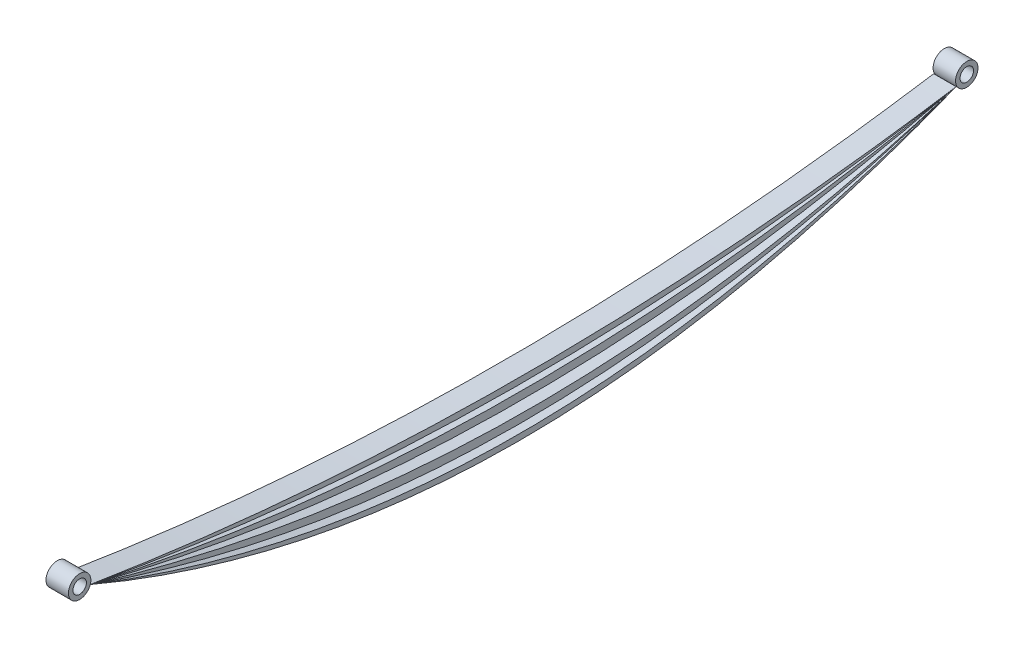
ISO-10303-21;
HEADER;
FILE_DESCRIPTION(('STEP AP214'),'2;1');
FILE_NAME('part.step','',(''),(''),'','','');
FILE_SCHEMA(('AUTOMOTIVE_DESIGN { 1 0 10303 214 1 1 1 1 }'));
ENDSEC;
DATA;
#1=APPLICATION_CONTEXT('core data for automotive mechanical design processes');
#2=APPLICATION_PROTOCOL_DEFINITION('international standard','automotive_design',2000,#1);
#3=PRODUCT_CONTEXT('',#1,'mechanical');
#4=PRODUCT('Part','Part','',(#3));
#5=PRODUCT_RELATED_PRODUCT_CATEGORY('part','',(#4));
#6=PRODUCT_DEFINITION_FORMATION('','',#4);
#7=PRODUCT_DEFINITION_CONTEXT('part definition',#1,'design');
#8=PRODUCT_DEFINITION('design','',#6,#7);
#9=PRODUCT_DEFINITION_SHAPE('','',#8);
#10=(LENGTH_UNIT() NAMED_UNIT(*) SI_UNIT(.MILLI.,.METRE.));
#11=(NAMED_UNIT(*) PLANE_ANGLE_UNIT() SI_UNIT($,.RADIAN.));
#12=(NAMED_UNIT(*) SI_UNIT($,.STERADIAN.) SOLID_ANGLE_UNIT());
#13=UNCERTAINTY_MEASURE_WITH_UNIT(LENGTH_MEASURE(1.E-05),#10,'distance_accuracy_value','');
#14=(GEOMETRIC_REPRESENTATION_CONTEXT(3) GLOBAL_UNCERTAINTY_ASSIGNED_CONTEXT((#13)) GLOBAL_UNIT_ASSIGNED_CONTEXT((#10,
#11,#12)) REPRESENTATION_CONTEXT('',''));
#15=CARTESIAN_POINT('',(0.,0.,0.));
#16=DIRECTION('',(0.,0.,1.));
#17=DIRECTION('',(1.,0.,0.));
#18=AXIS2_PLACEMENT_3D('',#15,#16,#17);
#19=CARTESIAN_POINT('',(5.,42.4695904430303,127.780848484848));
#20=CARTESIAN_POINT('',(5.,2.59767544920402,33.8122684678732));
#21=CARTESIAN_POINT('',(5.,42.0800146854546,-65.0591515151515));
#22=B_SPLINE_CURVE_WITH_KNOTS('',2,(#19,#20,#21),.UNSPECIFIED.,.F.,.F.,(3,3),(0.,1.),.UNSPECIFIED.);
#23=DIRECTION('',(-1.,0.,0.));
#24=VECTOR('',#23,1.);
#25=SURFACE_OF_LINEAR_EXTRUSION('',#22,#24);
#26=CARTESIAN_POINT('',(0.,42.4695904430303,127.780848484848));
#27=CARTESIAN_POINT('',(0.,2.59767544920402,33.8122684678732));
#28=CARTESIAN_POINT('',(0.,42.0800146854546,-65.0591515151515));
#29=B_SPLINE_CURVE_WITH_KNOTS('',2,(#26,#27,#28),.UNSPECIFIED.,.F.,.F.,(3,3),(0.,1.),.UNSPECIFIED.);
#30=CARTESIAN_POINT('',(0.,42.4695904430304,127.780848484848));
#31=VERTEX_POINT('',#30);
#32=CARTESIAN_POINT('',(0.,42.0800146854546,-65.0591515151515));
#33=VERTEX_POINT('',#32);
#34=EDGE_CURVE('E425',#31,#33,#29,.T.);
#35=ORIENTED_EDGE('',*,*,#34,.T.);
#36=DIRECTION('',(-1.,0.,0.));
#37=VECTOR('',#36,1.);
#38=CARTESIAN_POINT('',(5.,42.0800146854546,-65.0591515151515));
#39=LINE('',#38,#37);
#40=CARTESIAN_POINT('',(5.,42.0800146854546,-65.0591515151515));
#41=VERTEX_POINT('',#40);
#42=EDGE_CURVE('E13',#41,#33,#39,.T.);
#43=ORIENTED_EDGE('',*,*,#42,.F.);
#44=CARTESIAN_POINT('',(5.,42.4695904430304,127.780848484848));
#45=VERTEX_POINT('',#44);
#46=EDGE_CURVE('E424',#45,#41,#22,.T.);
#47=ORIENTED_EDGE('',*,*,#46,.F.);
#48=DIRECTION('',(-1.,0.,0.));
#49=VECTOR('',#48,1.);
#50=CARTESIAN_POINT('',(5.,42.4695904430304,127.780848484848));
#51=LINE('',#50,#49);
#52=EDGE_CURVE('E402',#45,#31,#51,.T.);
#53=ORIENTED_EDGE('',*,*,#52,.T.);
#54=EDGE_LOOP('',(#35,#43,#47,#53));
#55=FACE_BOUND('',#54,.T.);
#56=ADVANCED_FACE('F393',(#55),#25,.F.);
#57=CARTESIAN_POINT('',(5.,42.0800146854546,-65.0591515151515));
#58=CARTESIAN_POINT('',(5.,19.1425653210827,-2.95565801286543));
#59=CARTESIAN_POINT('',(5.,16.0514051439789,60.7489517648132));
#60=CARTESIAN_POINT('',(5.,42.4695904430304,127.780848484849));
#61=B_SPLINE_CURVE_WITH_KNOTS('',3,(#57,#58,#59,#60),.UNSPECIFIED.,.F.,.F.,(4,4),(0.,1.),.UNSPECIFIED.);
#62=DIRECTION('',(-1.,0.,0.));
#63=VECTOR('',#62,1.);
#64=SURFACE_OF_LINEAR_EXTRUSION('',#61,#63);
#65=CARTESIAN_POINT('',(0.,42.0800146854546,-65.0591515151515));
#66=CARTESIAN_POINT('',(0.,19.1425653210827,-2.95565801286543));
#67=CARTESIAN_POINT('',(0.,16.0514051439789,60.7489517648132));
#68=CARTESIAN_POINT('',(0.,42.4695904430304,127.780848484849));
#69=B_SPLINE_CURVE_WITH_KNOTS('',3,(#65,#66,#67,#68),.UNSPECIFIED.,.F.,.F.,(4,4),(0.,1.),.UNSPECIFIED.);
#70=EDGE_CURVE('E417',#33,#31,#69,.T.);
#71=ORIENTED_EDGE('',*,*,#70,.T.);
#72=ORIENTED_EDGE('',*,*,#52,.F.);
#73=EDGE_CURVE('E409',#41,#45,#61,.T.);
#74=ORIENTED_EDGE('',*,*,#73,.F.);
#75=ORIENTED_EDGE('',*,*,#42,.T.);
#76=EDGE_LOOP('',(#71,#72,#74,#75));
#77=FACE_BOUND('',#76,.T.);
#78=ADVANCED_FACE('F420',(#77),#64,.F.);
#79=CARTESIAN_POINT('',(5.,0.,0.));
#80=DIRECTION('',(1.,0.,0.));
#81=DIRECTION('',(0.,0.,-1.));
#82=AXIS2_PLACEMENT_3D('',#79,#80,#81);
#83=PLANE('',#82);
#84=ORIENTED_EDGE('',*,*,#46,.T.);
#85=ORIENTED_EDGE('',*,*,#73,.T.);
#86=EDGE_LOOP('',(#84,#85));
#87=FACE_BOUND('',#86,.T.);
#88=ADVANCED_FACE('F452',(#87),#83,.T.);
#89=CARTESIAN_POINT('',(0.,0.,0.));
#90=DIRECTION('',(1.,0.,0.));
#91=DIRECTION('',(0.,0.,-1.));
#92=AXIS2_PLACEMENT_3D('',#89,#90,#91);
#93=PLANE('',#92);
#94=ORIENTED_EDGE('',*,*,#34,.F.);
#95=ORIENTED_EDGE('',*,*,#70,.F.);
#96=EDGE_LOOP('',(#94,#95));
#97=FACE_BOUND('',#96,.T.);
#98=ADVANCED_FACE('F428',(#97),#93,.F.);
#99=CLOSED_SHELL('',(#56,#78,#88,#98));
#100=MANIFOLD_SOLID_BREP('B2',#99);
#101=CARTESIAN_POINT('',(5.,42.4695904430303,127.780848484848));
#102=CARTESIAN_POINT('',(5.,9.04748499481751,33.1527153679579));
#103=CARTESIAN_POINT('',(5.,42.0800146854546,-65.0591515151515));
#104=B_SPLINE_CURVE_WITH_KNOTS('',2,(#101,#102,#103),.UNSPECIFIED.,.F.,.F.,(3,3),(0.,1.),.UNSPECIFIED.);
#105=DIRECTION('',(-1.,0.,0.));
#106=VECTOR('',#105,1.);
#107=SURFACE_OF_LINEAR_EXTRUSION('',#104,#106);
#108=CARTESIAN_POINT('',(0.,42.4695904430303,127.780848484848));
#109=CARTESIAN_POINT('',(0.,9.04748499481751,33.1527153679579));
#110=CARTESIAN_POINT('',(0.,42.0800146854546,-65.0591515151515));
#111=B_SPLINE_CURVE_WITH_KNOTS('',2,(#108,#109,#110),.UNSPECIFIED.,.F.,.F.,(3,3),(0.,1.),.UNSPECIFIED.);
#112=CARTESIAN_POINT('',(0.,42.4695904430304,127.780848484848));
#113=VERTEX_POINT('',#112);
#114=CARTESIAN_POINT('',(0.,42.0800146854546,-65.0591515151515));
#115=VERTEX_POINT('',#114);
#116=EDGE_CURVE('E528',#113,#115,#111,.T.);
#117=ORIENTED_EDGE('',*,*,#116,.T.);
#118=DIRECTION('',(-1.,0.,0.));
#119=VECTOR('',#118,1.);
#120=CARTESIAN_POINT('',(5.,42.0800146854546,-65.0591515151515));
#121=LINE('',#120,#119);
#122=CARTESIAN_POINT('',(5.,42.0800146854546,-65.0591515151515));
#123=VERTEX_POINT('',#122);
#124=EDGE_CURVE('E391',#123,#115,#121,.T.);
#125=ORIENTED_EDGE('',*,*,#124,.F.);
#126=CARTESIAN_POINT('',(5.,42.4695904430304,127.780848484848));
#127=VERTEX_POINT('',#126);
#128=EDGE_CURVE('E527',#127,#123,#104,.T.);
#129=ORIENTED_EDGE('',*,*,#128,.F.);
#130=DIRECTION('',(-1.,0.,0.));
#131=VECTOR('',#130,1.);
#132=CARTESIAN_POINT('',(5.,42.4695904430304,127.780848484848));
#133=LINE('',#132,#131);
#134=EDGE_CURVE('E505',#127,#113,#133,.T.);
#135=ORIENTED_EDGE('',*,*,#134,.T.);
#136=EDGE_LOOP('',(#117,#125,#129,#135));
#137=FACE_BOUND('',#136,.T.);
#138=ADVANCED_FACE('F496',(#137),#107,.F.);
#139=CARTESIAN_POINT('',(5.,42.0800146854546,-65.0591515151515));
#140=CARTESIAN_POINT('',(5.,12.5922766256158,28.6722652665019));
#141=CARTESIAN_POINT('',(5.,42.4695904430303,127.780848484848));
#142=B_SPLINE_CURVE_WITH_KNOTS('',2,(#139,#140,#141),.UNSPECIFIED.,.F.,.F.,(3,3),(0.,1.),.UNSPECIFIED.);
#143=DIRECTION('',(-1.,0.,0.));
#144=VECTOR('',#143,1.);
#145=SURFACE_OF_LINEAR_EXTRUSION('',#142,#144);
#146=CARTESIAN_POINT('',(0.,42.0800146854546,-65.0591515151515));
#147=CARTESIAN_POINT('',(0.,12.5922766256158,28.6722652665019));
#148=CARTESIAN_POINT('',(0.,42.4695904430303,127.780848484848));
#149=B_SPLINE_CURVE_WITH_KNOTS('',2,(#146,#147,#148),.UNSPECIFIED.,.F.,.F.,(3,3),(0.,1.),.UNSPECIFIED.);
#150=EDGE_CURVE('E520',#115,#113,#149,.T.);
#151=ORIENTED_EDGE('',*,*,#150,.T.);
#152=ORIENTED_EDGE('',*,*,#134,.F.);
#153=EDGE_CURVE('E512',#123,#127,#142,.T.);
#154=ORIENTED_EDGE('',*,*,#153,.F.);
#155=ORIENTED_EDGE('',*,*,#124,.T.);
#156=EDGE_LOOP('',(#151,#152,#154,#155));
#157=FACE_BOUND('',#156,.T.);
#158=ADVANCED_FACE('F523',(#157),#145,.F.);
#159=CARTESIAN_POINT('',(5.,0.,0.));
#160=DIRECTION('',(1.,0.,0.));
#161=DIRECTION('',(0.,0.,-1.));
#162=AXIS2_PLACEMENT_3D('',#159,#160,#161);
#163=PLANE('',#162);
#164=ORIENTED_EDGE('',*,*,#128,.T.);
#165=ORIENTED_EDGE('',*,*,#153,.T.);
#166=EDGE_LOOP('',(#164,#165));
#167=FACE_BOUND('',#166,.T.);
#168=ADVANCED_FACE('F555',(#167),#163,.T.);
#169=CARTESIAN_POINT('',(0.,0.,0.));
#170=DIRECTION('',(1.,0.,0.));
#171=DIRECTION('',(0.,0.,-1.));
#172=AXIS2_PLACEMENT_3D('',#169,#170,#171);
#173=PLANE('',#172);
#174=ORIENTED_EDGE('',*,*,#116,.F.);
#175=ORIENTED_EDGE('',*,*,#150,.F.);
#176=EDGE_LOOP('',(#174,#175));
#177=FACE_BOUND('',#176,.T.);
#178=ADVANCED_FACE('F531',(#177),#173,.F.);
#179=CLOSED_SHELL('',(#138,#158,#168,#178));
#180=MANIFOLD_SOLID_BREP('B7',#179);
#181=CARTESIAN_POINT('',(5.,42.4695904430303,127.780848484848));
#182=CARTESIAN_POINT('',(5.,21.3439499981108,32.79082066014));
#183=CARTESIAN_POINT('',(5.,42.0800146854546,-65.0591515151515));
#184=B_SPLINE_CURVE_WITH_KNOTS('',2,(#181,#182,#183),.UNSPECIFIED.,.F.,.F.,(3,3),(0.,1.),.UNSPECIFIED.);
#185=DIRECTION('',(-1.,0.,0.));
#186=VECTOR('',#185,1.);
#187=SURFACE_OF_LINEAR_EXTRUSION('',#184,#186);
#188=CARTESIAN_POINT('',(0.,42.4695904430303,127.780848484848));
#189=CARTESIAN_POINT('',(0.,21.3439499981108,32.79082066014));
#190=CARTESIAN_POINT('',(0.,42.0800146854546,-65.0591515151515));
#191=B_SPLINE_CURVE_WITH_KNOTS('',2,(#188,#189,#190),.UNSPECIFIED.,.F.,.F.,(3,3),(0.,1.),.UNSPECIFIED.);
#192=CARTESIAN_POINT('',(0.,42.4695904430304,127.780848484848));
#193=VERTEX_POINT('',#192);
#194=CARTESIAN_POINT('',(0.,42.0800146854546,-65.0591515151515));
#195=VERTEX_POINT('',#194);
#196=EDGE_CURVE('E628',#193,#195,#191,.T.);
#197=ORIENTED_EDGE('',*,*,#196,.F.);
#198=DIRECTION('',(-1.,0.,0.));
#199=VECTOR('',#198,1.);
#200=CARTESIAN_POINT('',(5.,42.4695904430304,127.780848484848));
#201=LINE('',#200,#199);
#202=CARTESIAN_POINT('',(5.,42.4695904430304,127.780848484848));
#203=VERTEX_POINT('',#202);
#204=EDGE_CURVE('E494',#203,#193,#201,.T.);
#205=ORIENTED_EDGE('',*,*,#204,.F.);
#206=CARTESIAN_POINT('',(5.,42.0800146854546,-65.0591515151515));
#207=VERTEX_POINT('',#206);
#208=EDGE_CURVE('E629',#203,#207,#184,.T.);
#209=ORIENTED_EDGE('',*,*,#208,.T.);
#210=DIRECTION('',(-1.,0.,0.));
#211=VECTOR('',#210,1.);
#212=CARTESIAN_POINT('',(5.,42.0800146854546,-65.0591515151515));
#213=LINE('',#212,#211);
#214=EDGE_CURVE('E608',#207,#195,#213,.T.);
#215=ORIENTED_EDGE('',*,*,#214,.T.);
#216=EDGE_LOOP('',(#197,#205,#209,#215));
#217=FACE_BOUND('',#216,.T.);
#218=ADVANCED_FACE('F599',(#217),#187,.T.);
#219=CARTESIAN_POINT('',(5.,42.4695904430303,127.780848484848));
#220=CARTESIAN_POINT('',(5.,17.7906847431026,32.3332020838322));
#221=CARTESIAN_POINT('',(5.,42.0800146854546,-65.0591515151515));
#222=B_SPLINE_CURVE_WITH_KNOTS('',2,(#219,#220,#221),.UNSPECIFIED.,.F.,.F.,(3,3),(0.,1.),.UNSPECIFIED.);
#223=DIRECTION('',(-1.,0.,0.));
#224=VECTOR('',#223,1.);
#225=SURFACE_OF_LINEAR_EXTRUSION('',#222,#224);
#226=CARTESIAN_POINT('',(0.,42.4695904430303,127.780848484848));
#227=CARTESIAN_POINT('',(0.,17.7906847431026,32.3332020838322));
#228=CARTESIAN_POINT('',(0.,42.0800146854546,-65.0591515151515));
#229=B_SPLINE_CURVE_WITH_KNOTS('',2,(#226,#227,#228),.UNSPECIFIED.,.F.,.F.,(3,3),(0.,1.),.UNSPECIFIED.);
#230=EDGE_CURVE('E630',#193,#195,#229,.T.);
#231=ORIENTED_EDGE('',*,*,#230,.T.);
#232=ORIENTED_EDGE('',*,*,#214,.F.);
#233=EDGE_CURVE('E615',#203,#207,#222,.T.);
#234=ORIENTED_EDGE('',*,*,#233,.F.);
#235=ORIENTED_EDGE('',*,*,#204,.T.);
#236=EDGE_LOOP('',(#231,#232,#234,#235));
#237=FACE_BOUND('',#236,.T.);
#238=ADVANCED_FACE('F631',(#237),#225,.F.);
#239=CARTESIAN_POINT('',(5.,0.,0.));
#240=DIRECTION('',(1.,0.,0.));
#241=DIRECTION('',(0.,0.,-1.));
#242=AXIS2_PLACEMENT_3D('',#239,#240,#241);
#243=PLANE('',#242);
#244=ORIENTED_EDGE('',*,*,#208,.F.);
#245=ORIENTED_EDGE('',*,*,#233,.T.);
#246=EDGE_LOOP('',(#244,#245));
#247=FACE_BOUND('',#246,.T.);
#248=ADVANCED_FACE('F658',(#247),#243,.T.);
#249=CARTESIAN_POINT('',(0.,0.,0.));
#250=DIRECTION('',(1.,0.,0.));
#251=DIRECTION('',(0.,0.,-1.));
#252=AXIS2_PLACEMENT_3D('',#249,#250,#251);
#253=PLANE('',#252);
#254=ORIENTED_EDGE('',*,*,#196,.T.);
#255=ORIENTED_EDGE('',*,*,#230,.F.);
#256=EDGE_LOOP('',(#254,#255));
#257=FACE_BOUND('',#256,.T.);
#258=ADVANCED_FACE('F634',(#257),#253,.F.);
#259=CLOSED_SHELL('',(#218,#238,#248,#258));
#260=MANIFOLD_SOLID_BREP('B385',#259);
#261=CARTESIAN_POINT('',(5.,42.4695904430303,127.780848484848));
#262=CARTESIAN_POINT('',(5.,26.9703184578535,31.7553583374396));
#263=CARTESIAN_POINT('',(5.,42.0800146854546,-65.0591515151515));
#264=B_SPLINE_CURVE_WITH_KNOTS('',2,(#261,#262,#263),.UNSPECIFIED.,.F.,.F.,(3,3),(0.,1.),.UNSPECIFIED.);
#265=DIRECTION('',(-1.,0.,0.));
#266=VECTOR('',#265,1.);
#267=SURFACE_OF_LINEAR_EXTRUSION('',#264,#266);
#268=CARTESIAN_POINT('',(0.,42.4695904430303,127.780848484848));
#269=CARTESIAN_POINT('',(0.,26.9703184578535,31.7553583374396));
#270=CARTESIAN_POINT('',(0.,42.0800146854546,-65.0591515151515));
#271=B_SPLINE_CURVE_WITH_KNOTS('',2,(#268,#269,#270),.UNSPECIFIED.,.F.,.F.,(3,3),(0.,1.),.UNSPECIFIED.);
#272=CARTESIAN_POINT('',(0.,42.4695904430304,127.780848484848));
#273=VERTEX_POINT('',#272);
#274=CARTESIAN_POINT('',(0.,42.0800146854546,-65.0591515151515));
#275=VERTEX_POINT('',#274);
#276=EDGE_CURVE('E729',#273,#275,#271,.T.);
#277=ORIENTED_EDGE('',*,*,#276,.F.);
#278=DIRECTION('',(-1.,0.,0.));
#279=VECTOR('',#278,1.);
#280=CARTESIAN_POINT('',(5.,42.4695904430304,127.780848484848));
#281=LINE('',#280,#279);
#282=CARTESIAN_POINT('',(5.,42.4695904430304,127.780848484848));
#283=VERTEX_POINT('',#282);
#284=EDGE_CURVE('E597',#283,#273,#281,.T.);
#285=ORIENTED_EDGE('',*,*,#284,.F.);
#286=CARTESIAN_POINT('',(5.,42.0800146854546,-65.0591515151515));
#287=VERTEX_POINT('',#286);
#288=EDGE_CURVE('E730',#283,#287,#264,.T.);
#289=ORIENTED_EDGE('',*,*,#288,.T.);
#290=DIRECTION('',(-1.,0.,0.));
#291=VECTOR('',#290,1.);
#292=CARTESIAN_POINT('',(5.,42.0800146854546,-65.0591515151515));
#293=LINE('',#292,#291);
#294=EDGE_CURVE('E709',#287,#275,#293,.T.);
#295=ORIENTED_EDGE('',*,*,#294,.T.);
#296=EDGE_LOOP('',(#277,#285,#289,#295));
#297=FACE_BOUND('',#296,.T.);
#298=ADVANCED_FACE('F700',(#297),#267,.T.);
#299=CARTESIAN_POINT('',(5.,42.4695904430303,127.780848484848));
#300=CARTESIAN_POINT('',(5.,24.2429326538451,32.196029377044));
#301=CARTESIAN_POINT('',(5.,42.0800146854546,-65.0591515151515));
#302=B_SPLINE_CURVE_WITH_KNOTS('',2,(#299,#300,#301),.UNSPECIFIED.,.F.,.F.,(3,3),(0.,1.),.UNSPECIFIED.);
#303=DIRECTION('',(-1.,0.,0.));
#304=VECTOR('',#303,1.);
#305=SURFACE_OF_LINEAR_EXTRUSION('',#302,#304);
#306=CARTESIAN_POINT('',(0.,42.4695904430303,127.780848484848));
#307=CARTESIAN_POINT('',(0.,24.2429326538451,32.196029377044));
#308=CARTESIAN_POINT('',(0.,42.0800146854546,-65.0591515151515));
#309=B_SPLINE_CURVE_WITH_KNOTS('',2,(#306,#307,#308),.UNSPECIFIED.,.F.,.F.,(3,3),(0.,1.),.UNSPECIFIED.);
#310=EDGE_CURVE('E731',#273,#275,#309,.T.);
#311=ORIENTED_EDGE('',*,*,#310,.T.);
#312=ORIENTED_EDGE('',*,*,#294,.F.);
#313=EDGE_CURVE('E716',#283,#287,#302,.T.);
#314=ORIENTED_EDGE('',*,*,#313,.F.);
#315=ORIENTED_EDGE('',*,*,#284,.T.);
#316=EDGE_LOOP('',(#311,#312,#314,#315));
#317=FACE_BOUND('',#316,.T.);
#318=ADVANCED_FACE('F732',(#317),#305,.F.);
#319=CARTESIAN_POINT('',(5.,0.,0.));
#320=DIRECTION('',(1.,0.,0.));
#321=DIRECTION('',(0.,0.,-1.));
#322=AXIS2_PLACEMENT_3D('',#319,#320,#321);
#323=PLANE('',#322);
#324=ORIENTED_EDGE('',*,*,#288,.F.);
#325=ORIENTED_EDGE('',*,*,#313,.T.);
#326=EDGE_LOOP('',(#324,#325));
#327=FACE_BOUND('',#326,.T.);
#328=ADVANCED_FACE('F759',(#327),#323,.T.);
#329=CARTESIAN_POINT('',(0.,0.,0.));
#330=DIRECTION('',(1.,0.,0.));
#331=DIRECTION('',(0.,0.,-1.));
#332=AXIS2_PLACEMENT_3D('',#329,#330,#331);
#333=PLANE('',#332);
#334=ORIENTED_EDGE('',*,*,#276,.T.);
#335=ORIENTED_EDGE('',*,*,#310,.F.);
#336=EDGE_LOOP('',(#334,#335));
#337=FACE_BOUND('',#336,.T.);
#338=ADVANCED_FACE('F735',(#337),#333,.F.);
#339=CLOSED_SHELL('',(#298,#318,#328,#338));
#340=MANIFOLD_SOLID_BREP('B488',#339);
#341=CARTESIAN_POINT('',(5.,43.261372857186,-67.4304550825242));
#342=DIRECTION('',(-1.,0.,0.));
#343=DIRECTION('',(0.,0.,1.));
#344=AXIS2_PLACEMENT_3D('',#341,#342,#343);
#345=CYLINDRICAL_SURFACE('',#344,2.5);
#346=CARTESIAN_POINT('',(5.,43.261372857186,-67.4304550825242));
#347=DIRECTION('',(1.,0.,0.));
#348=DIRECTION('',(0.,0.,-1.));
#349=AXIS2_PLACEMENT_3D('',#346,#347,#348);
#350=CIRCLE('',#349,2.5);
#351=CARTESIAN_POINT('',(5.,43.261372857186,-69.9304550825242));
#352=VERTEX_POINT('',#351);
#353=EDGE_CURVE('E699',#352,#352,#350,.F.);
#354=ORIENTED_EDGE('',*,*,#353,.T.);
#355=EDGE_LOOP('',(#354));
#356=FACE_BOUND('',#355,.T.);
#357=CARTESIAN_POINT('',(0.,43.261372857186,-67.4304550825242));
#358=DIRECTION('',(1.,0.,0.));
#359=DIRECTION('',(0.,0.,-1.));
#360=AXIS2_PLACEMENT_3D('',#357,#358,#359);
#361=CIRCLE('',#360,2.5);
#362=CARTESIAN_POINT('',(0.,43.261372857186,-69.9304550825242));
#363=VERTEX_POINT('',#362);
#364=EDGE_CURVE('E803',#363,#363,#361,.F.);
#365=ORIENTED_EDGE('',*,*,#364,.F.);
#366=EDGE_LOOP('',(#365));
#367=FACE_BOUND('',#366,.T.);
#368=ADVANCED_FACE('F800',(#356,#367),#345,.T.);
#369=CARTESIAN_POINT('',(5.,0.,0.));
#370=DIRECTION('',(1.,0.,0.));
#371=DIRECTION('',(0.,0.,-1.));
#372=AXIS2_PLACEMENT_3D('',#369,#370,#371);
#373=PLANE('',#372);
#374=CARTESIAN_POINT('',(5.,43.261372857186,-67.4304550825242));
#375=DIRECTION('',(1.,0.,0.));
#376=DIRECTION('',(0.,0.,-1.));
#377=AXIS2_PLACEMENT_3D('',#374,#375,#376);
#378=CIRCLE('',#377,1.5);
#379=CARTESIAN_POINT('',(5.,43.261372857186,-68.9304550825242));
#380=VERTEX_POINT('',#379);
#381=EDGE_CURVE('E812',#380,#380,#378,.T.);
#382=ORIENTED_EDGE('',*,*,#381,.F.);
#383=EDGE_LOOP('',(#382));
#384=FACE_BOUND('',#383,.T.);
#385=ORIENTED_EDGE('',*,*,#353,.F.);
#386=EDGE_LOOP('',(#385));
#387=FACE_BOUND('',#386,.T.);
#388=ADVANCED_FACE('F827',(#384,#387),#373,.T.);
#389=CARTESIAN_POINT('',(0.,0.,0.));
#390=DIRECTION('',(1.,0.,0.));
#391=DIRECTION('',(0.,0.,-1.));
#392=AXIS2_PLACEMENT_3D('',#389,#390,#391);
#393=PLANE('',#392);
#394=CARTESIAN_POINT('',(0.,43.261372857186,-67.4304550825242));
#395=DIRECTION('',(1.,0.,0.));
#396=DIRECTION('',(0.,0.,-1.));
#397=AXIS2_PLACEMENT_3D('',#394,#395,#396);
#398=CIRCLE('',#397,1.5);
#399=CARTESIAN_POINT('',(0.,43.261372857186,-68.9304550825242));
#400=VERTEX_POINT('',#399);
#401=EDGE_CURVE('E810',#400,#400,#398,.T.);
#402=ORIENTED_EDGE('',*,*,#401,.T.);
#403=EDGE_LOOP('',(#402));
#404=FACE_BOUND('',#403,.T.);
#405=ORIENTED_EDGE('',*,*,#364,.T.);
#406=EDGE_LOOP('',(#405));
#407=FACE_BOUND('',#406,.T.);
#408=ADVANCED_FACE('F818',(#404,#407),#393,.F.);
#409=CARTESIAN_POINT('',(0.,43.261372857186,-67.4304550825242));
#410=DIRECTION('',(1.,0.,0.));
#411=DIRECTION('',(0.,0.,-1.));
#412=AXIS2_PLACEMENT_3D('',#409,#410,#411);
#413=CYLINDRICAL_SURFACE('',#412,1.5);
#414=ORIENTED_EDGE('',*,*,#401,.F.);
#415=EDGE_LOOP('',(#414));
#416=FACE_BOUND('',#415,.T.);
#417=ORIENTED_EDGE('',*,*,#381,.T.);
#418=EDGE_LOOP('',(#417));
#419=FACE_BOUND('',#418,.T.);
#420=ADVANCED_FACE('F821',(#416,#419),#413,.F.);
#421=CLOSED_SHELL('',(#368,#388,#408,#420));
#422=MANIFOLD_SOLID_BREP('B591',#421);
#423=CARTESIAN_POINT('',(5.,43.261372857186,130.152152052221));
#424=DIRECTION('',(-1.,0.,0.));
#425=DIRECTION('',(0.,0.,1.));
#426=AXIS2_PLACEMENT_3D('',#423,#424,#425);
#427=CYLINDRICAL_SURFACE('',#426,2.5);
#428=CARTESIAN_POINT('',(5.,43.261372857186,130.152152052221));
#429=DIRECTION('',(1.,0.,0.));
#430=DIRECTION('',(0.,0.,-1.));
#431=AXIS2_PLACEMENT_3D('',#428,#429,#430);
#432=CIRCLE('',#431,2.5);
#433=CARTESIAN_POINT('',(5.,43.261372857186,127.652152052221));
#434=VERTEX_POINT('',#433);
#435=EDGE_CURVE('E799',#434,#434,#432,.T.);
#436=ORIENTED_EDGE('',*,*,#435,.F.);
#437=EDGE_LOOP('',(#436));
#438=FACE_BOUND('',#437,.T.);
#439=CARTESIAN_POINT('',(0.,43.261372857186,130.152152052221));
#440=DIRECTION('',(1.,0.,0.));
#441=DIRECTION('',(0.,0.,-1.));
#442=AXIS2_PLACEMENT_3D('',#439,#440,#441);
#443=CIRCLE('',#442,2.5);
#444=CARTESIAN_POINT('',(0.,43.261372857186,127.652152052221));
#445=VERTEX_POINT('',#444);
#446=EDGE_CURVE('E864',#445,#445,#443,.T.);
#447=ORIENTED_EDGE('',*,*,#446,.T.);
#448=EDGE_LOOP('',(#447));
#449=FACE_BOUND('',#448,.T.);
#450=ADVANCED_FACE('F861',(#438,#449),#427,.T.);
#451=CARTESIAN_POINT('',(5.,0.,0.));
#452=DIRECTION('',(1.,0.,0.));
#453=DIRECTION('',(0.,0.,-1.));
#454=AXIS2_PLACEMENT_3D('',#451,#452,#453);
#455=PLANE('',#454);
#456=CARTESIAN_POINT('',(5.,43.261372857186,130.152152052221));
#457=DIRECTION('',(-1.,0.,0.));
#458=DIRECTION('',(0.,0.,1.));
#459=AXIS2_PLACEMENT_3D('',#456,#457,#458);
#460=CIRCLE('',#459,1.5);
#461=CARTESIAN_POINT('',(5.,43.261372857186,131.652152052221));
#462=VERTEX_POINT('',#461);
#463=EDGE_CURVE('E871',#462,#462,#460,.T.);
#464=ORIENTED_EDGE('',*,*,#463,.T.);
#465=EDGE_LOOP('',(#464));
#466=FACE_BOUND('',#465,.T.);
#467=ORIENTED_EDGE('',*,*,#435,.T.);
#468=EDGE_LOOP('',(#467));
#469=FACE_BOUND('',#468,.T.);
#470=ADVANCED_FACE('F879',(#466,#469),#455,.T.);
#471=CARTESIAN_POINT('',(0.,0.,0.));
#472=DIRECTION('',(1.,0.,0.));
#473=DIRECTION('',(0.,0.,-1.));
#474=AXIS2_PLACEMENT_3D('',#471,#472,#473);
#475=PLANE('',#474);
#476=CARTESIAN_POINT('',(0.,43.261372857186,130.152152052221));
#477=DIRECTION('',(-1.,0.,0.));
#478=DIRECTION('',(0.,0.,1.));
#479=AXIS2_PLACEMENT_3D('',#476,#477,#478);
#480=CIRCLE('',#479,1.5);
#481=CARTESIAN_POINT('',(0.,43.261372857186,131.652152052221));
#482=VERTEX_POINT('',#481);
#483=EDGE_CURVE('E873',#482,#482,#480,.T.);
#484=ORIENTED_EDGE('',*,*,#483,.F.);
#485=EDGE_LOOP('',(#484));
#486=FACE_BOUND('',#485,.T.);
#487=ORIENTED_EDGE('',*,*,#446,.F.);
#488=EDGE_LOOP('',(#487));
#489=FACE_BOUND('',#488,.T.);
#490=ADVANCED_FACE('F884',(#486,#489),#475,.F.);
#491=CARTESIAN_POINT('',(5.,43.261372857186,130.152152052221));
#492=DIRECTION('',(-1.,0.,0.));
#493=DIRECTION('',(0.,0.,1.));
#494=AXIS2_PLACEMENT_3D('',#491,#492,#493);
#495=CYLINDRICAL_SURFACE('',#494,1.5);
#496=ORIENTED_EDGE('',*,*,#463,.F.);
#497=EDGE_LOOP('',(#496));
#498=FACE_BOUND('',#497,.T.);
#499=ORIENTED_EDGE('',*,*,#483,.T.);
#500=EDGE_LOOP('',(#499));
#501=FACE_BOUND('',#500,.T.);
#502=ADVANCED_FACE('F881',(#498,#501),#495,.F.);
#503=CLOSED_SHELL('',(#450,#470,#490,#502));
#504=MANIFOLD_SOLID_BREP('B694',#503);
#505=ADVANCED_BREP_SHAPE_REPRESENTATION('',(#18,#100,#180,#260,#340,#422,#504),#14);
#506=SHAPE_DEFINITION_REPRESENTATION(#9,#505);
ENDSEC;
END-ISO-10303-21;
